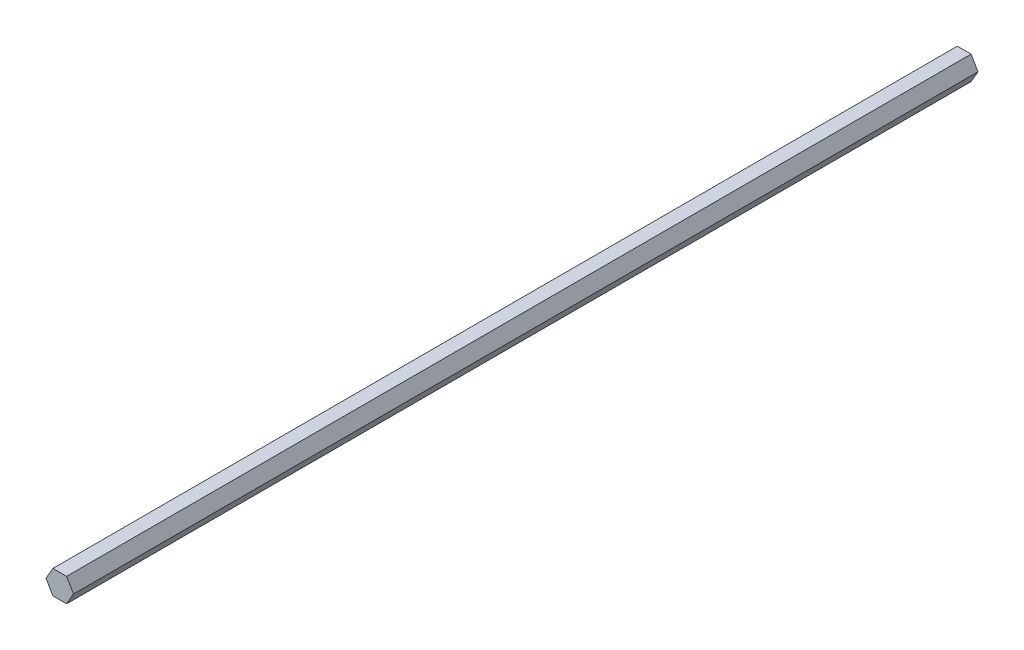
ISO-10303-21;
HEADER;
FILE_DESCRIPTION(('STEP AP214'),'2;1');
FILE_NAME('part.step','',(''),(''),'','','');
FILE_SCHEMA(('AUTOMOTIVE_DESIGN { 1 0 10303 214 1 1 1 1 }'));
ENDSEC;
DATA;
#1=APPLICATION_CONTEXT('core data for automotive mechanical design processes');
#2=APPLICATION_PROTOCOL_DEFINITION('international standard','automotive_design',2000,#1);
#3=PRODUCT_CONTEXT('',#1,'mechanical');
#4=PRODUCT('Part','Part','',(#3));
#5=PRODUCT_RELATED_PRODUCT_CATEGORY('part','',(#4));
#6=PRODUCT_DEFINITION_FORMATION('','',#4);
#7=PRODUCT_DEFINITION_CONTEXT('part definition',#1,'design');
#8=PRODUCT_DEFINITION('design','',#6,#7);
#9=PRODUCT_DEFINITION_SHAPE('','',#8);
#10=(LENGTH_UNIT() NAMED_UNIT(*) SI_UNIT(.MILLI.,.METRE.));
#11=(NAMED_UNIT(*) PLANE_ANGLE_UNIT() SI_UNIT($,.RADIAN.));
#12=(NAMED_UNIT(*) SI_UNIT($,.STERADIAN.) SOLID_ANGLE_UNIT());
#13=UNCERTAINTY_MEASURE_WITH_UNIT(LENGTH_MEASURE(1.E-05),#10,'distance_accuracy_value','');
#14=(GEOMETRIC_REPRESENTATION_CONTEXT(3) GLOBAL_UNCERTAINTY_ASSIGNED_CONTEXT((#13)) GLOBAL_UNIT_ASSIGNED_CONTEXT((#10,
#11,#12)) REPRESENTATION_CONTEXT('',''));
#15=CARTESIAN_POINT('',(0.,0.,0.));
#16=DIRECTION('',(0.,0.,1.));
#17=DIRECTION('',(1.,0.,0.));
#18=AXIS2_PLACEMENT_3D('',#15,#16,#17);
#19=CARTESIAN_POINT('',(-3.66617420935413,-6.35,241.3));
#20=DIRECTION('',(0.,1.,0.));
#21=DIRECTION('',(0.,0.,1.));
#22=AXIS2_PLACEMENT_3D('',#19,#20,#21);
#23=PLANE('',#22);
#24=DIRECTION('',(1.,0.,0.));
#25=VECTOR('',#24,1.);
#26=CARTESIAN_POINT('',(-3.66617420935413,-6.35,-241.3));
#27=LINE('',#26,#25);
#28=CARTESIAN_POINT('',(-3.66617420935413,-6.35,-241.3));
#29=VERTEX_POINT('',#28);
#30=CARTESIAN_POINT('',(3.66617420935412,-6.35,-241.3));
#31=VERTEX_POINT('',#30);
#32=EDGE_CURVE('E117',#29,#31,#27,.T.);
#33=ORIENTED_EDGE('',*,*,#32,.T.);
#34=DIRECTION('',(0.,0.,-1.));
#35=VECTOR('',#34,1.);
#36=CARTESIAN_POINT('',(3.66617420935412,-6.35,241.3));
#37=LINE('',#36,#35);
#38=CARTESIAN_POINT('',(3.66617420935412,-6.35,241.3));
#39=VERTEX_POINT('',#38);
#40=EDGE_CURVE('E11',#39,#31,#37,.T.);
#41=ORIENTED_EDGE('',*,*,#40,.F.);
#42=DIRECTION('',(1.,0.,0.));
#43=VECTOR('',#42,1.);
#44=CARTESIAN_POINT('',(-3.66617420935413,-6.35,241.3));
#45=LINE('',#44,#43);
#46=CARTESIAN_POINT('',(-3.66617420935413,-6.35,241.3));
#47=VERTEX_POINT('',#46);
#48=EDGE_CURVE('E127',#47,#39,#45,.T.);
#49=ORIENTED_EDGE('',*,*,#48,.F.);
#50=DIRECTION('',(0.,0.,-1.));
#51=VECTOR('',#50,1.);
#52=CARTESIAN_POINT('',(-3.66617420935413,-6.35,241.3));
#53=LINE('',#52,#51);
#54=EDGE_CURVE('E113',#47,#29,#53,.T.);
#55=ORIENTED_EDGE('',*,*,#54,.T.);
#56=EDGE_LOOP('',(#33,#41,#49,#55));
#57=FACE_BOUND('',#56,.T.);
#58=ADVANCED_FACE('F33',(#57),#23,.F.);
#59=CARTESIAN_POINT('',(3.66617420935412,-6.35,241.3));
#60=DIRECTION('',(-0.866025403784438,0.5,0.));
#61=DIRECTION('',(-0.5,-0.866025403784439,0.));
#62=AXIS2_PLACEMENT_3D('',#59,#60,#61);
#63=PLANE('',#62);
#64=DIRECTION('',(0.5,0.866025403784439,0.));
#65=VECTOR('',#64,1.);
#66=CARTESIAN_POINT('',(3.66617420935412,-6.35,-241.3));
#67=LINE('',#66,#65);
#68=CARTESIAN_POINT('',(7.33234841870825,0.,-241.3));
#69=VERTEX_POINT('',#68);
#70=EDGE_CURVE('E120',#31,#69,#67,.T.);
#71=ORIENTED_EDGE('',*,*,#70,.T.);
#72=DIRECTION('',(0.,0.,-1.));
#73=VECTOR('',#72,1.);
#74=CARTESIAN_POINT('',(7.33234841870825,0.,241.3));
#75=LINE('',#74,#73);
#76=CARTESIAN_POINT('',(7.33234841870825,0.,241.3));
#77=VERTEX_POINT('',#76);
#78=EDGE_CURVE('E41',#77,#69,#75,.T.);
#79=ORIENTED_EDGE('',*,*,#78,.F.);
#80=DIRECTION('',(0.5,0.866025403784439,0.));
#81=VECTOR('',#80,1.);
#82=CARTESIAN_POINT('',(3.66617420935412,-6.35,241.3));
#83=LINE('',#82,#81);
#84=EDGE_CURVE('E86',#39,#77,#83,.T.);
#85=ORIENTED_EDGE('',*,*,#84,.F.);
#86=ORIENTED_EDGE('',*,*,#40,.T.);
#87=EDGE_LOOP('',(#71,#79,#85,#86));
#88=FACE_BOUND('',#87,.T.);
#89=ADVANCED_FACE('F151',(#88),#63,.F.);
#90=CARTESIAN_POINT('',(7.33234841870825,0.,241.3));
#91=DIRECTION('',(-0.866025403784439,-0.5,0.));
#92=DIRECTION('',(0.5,-0.866025403784439,0.));
#93=AXIS2_PLACEMENT_3D('',#90,#91,#92);
#94=PLANE('',#93);
#95=DIRECTION('',(-0.5,0.866025403784439,0.));
#96=VECTOR('',#95,1.);
#97=CARTESIAN_POINT('',(7.33234841870825,0.,-241.3));
#98=LINE('',#97,#96);
#99=CARTESIAN_POINT('',(3.66617420935413,6.35,-241.3));
#100=VERTEX_POINT('',#99);
#101=EDGE_CURVE('E122',#69,#100,#98,.T.);
#102=ORIENTED_EDGE('',*,*,#101,.T.);
#103=DIRECTION('',(0.,0.,-1.));
#104=VECTOR('',#103,1.);
#105=CARTESIAN_POINT('',(3.66617420935413,6.35,241.3));
#106=LINE('',#105,#104);
#107=CARTESIAN_POINT('',(3.66617420935413,6.35,241.3));
#108=VERTEX_POINT('',#107);
#109=EDGE_CURVE('E108',#108,#100,#106,.T.);
#110=ORIENTED_EDGE('',*,*,#109,.F.);
#111=DIRECTION('',(-0.5,0.866025403784439,0.));
#112=VECTOR('',#111,1.);
#113=CARTESIAN_POINT('',(7.33234841870825,0.,241.3));
#114=LINE('',#113,#112);
#115=EDGE_CURVE('E99',#77,#108,#114,.T.);
#116=ORIENTED_EDGE('',*,*,#115,.F.);
#117=ORIENTED_EDGE('',*,*,#78,.T.);
#118=EDGE_LOOP('',(#102,#110,#116,#117));
#119=FACE_BOUND('',#118,.T.);
#120=ADVANCED_FACE('F133',(#119),#94,.F.);
#121=CARTESIAN_POINT('',(3.66617420935413,6.35,241.3));
#122=DIRECTION('',(0.,-1.,0.));
#123=DIRECTION('',(0.,0.,-1.));
#124=AXIS2_PLACEMENT_3D('',#121,#122,#123);
#125=PLANE('',#124);
#126=DIRECTION('',(-1.,0.,0.));
#127=VECTOR('',#126,1.);
#128=CARTESIAN_POINT('',(3.66617420935413,6.35,-241.3));
#129=LINE('',#128,#127);
#130=CARTESIAN_POINT('',(-3.66617420935412,6.35,-241.3));
#131=VERTEX_POINT('',#130);
#132=EDGE_CURVE('E107',#100,#131,#129,.T.);
#133=ORIENTED_EDGE('',*,*,#132,.T.);
#134=DIRECTION('',(0.,0.,-1.));
#135=VECTOR('',#134,1.);
#136=CARTESIAN_POINT('',(-3.66617420935412,6.35,241.3));
#137=LINE('',#136,#135);
#138=CARTESIAN_POINT('',(-3.66617420935412,6.35,241.3));
#139=VERTEX_POINT('',#138);
#140=EDGE_CURVE('E104',#139,#131,#137,.T.);
#141=ORIENTED_EDGE('',*,*,#140,.F.);
#142=DIRECTION('',(-1.,0.,0.));
#143=VECTOR('',#142,1.);
#144=CARTESIAN_POINT('',(3.66617420935413,6.35,241.3));
#145=LINE('',#144,#143);
#146=EDGE_CURVE('E93',#108,#139,#145,.T.);
#147=ORIENTED_EDGE('',*,*,#146,.F.);
#148=ORIENTED_EDGE('',*,*,#109,.T.);
#149=EDGE_LOOP('',(#133,#141,#147,#148));
#150=FACE_BOUND('',#149,.T.);
#151=ADVANCED_FACE('F105',(#150),#125,.F.);
#152=CARTESIAN_POINT('',(-3.66617420935412,6.35,241.3));
#153=DIRECTION('',(0.866025403784438,-0.5,0.));
#154=DIRECTION('',(0.5,0.866025403784439,0.));
#155=AXIS2_PLACEMENT_3D('',#152,#153,#154);
#156=PLANE('',#155);
#157=DIRECTION('',(-0.5,-0.866025403784438,0.));
#158=VECTOR('',#157,1.);
#159=CARTESIAN_POINT('',(-3.66617420935412,6.35,-241.3));
#160=LINE('',#159,#158);
#161=CARTESIAN_POINT('',(-7.33234841870825,0.,-241.3));
#162=VERTEX_POINT('',#161);
#163=EDGE_CURVE('E72',#131,#162,#160,.T.);
#164=ORIENTED_EDGE('',*,*,#163,.T.);
#165=DIRECTION('',(0.,0.,-1.));
#166=VECTOR('',#165,1.);
#167=CARTESIAN_POINT('',(-7.33234841870825,0.,241.3));
#168=LINE('',#167,#166);
#169=CARTESIAN_POINT('',(-7.33234841870825,0.,241.3));
#170=VERTEX_POINT('',#169);
#171=EDGE_CURVE('E109',#170,#162,#168,.T.);
#172=ORIENTED_EDGE('',*,*,#171,.F.);
#173=DIRECTION('',(-0.5,-0.866025403784438,0.));
#174=VECTOR('',#173,1.);
#175=CARTESIAN_POINT('',(-3.66617420935412,6.35,241.3));
#176=LINE('',#175,#174);
#177=EDGE_CURVE('E97',#139,#170,#176,.T.);
#178=ORIENTED_EDGE('',*,*,#177,.F.);
#179=ORIENTED_EDGE('',*,*,#140,.T.);
#180=EDGE_LOOP('',(#164,#172,#178,#179));
#181=FACE_BOUND('',#180,.T.);
#182=ADVANCED_FACE('F111',(#181),#156,.F.);
#183=CARTESIAN_POINT('',(-7.33234841870825,0.,241.3));
#184=DIRECTION('',(0.866025403784439,0.5,0.));
#185=DIRECTION('',(-0.5,0.866025403784439,0.));
#186=AXIS2_PLACEMENT_3D('',#183,#184,#185);
#187=PLANE('',#186);
#188=DIRECTION('',(0.5,-0.866025403784439,0.));
#189=VECTOR('',#188,1.);
#190=CARTESIAN_POINT('',(-7.33234841870825,0.,-241.3));
#191=LINE('',#190,#189);
#192=EDGE_CURVE('E78',#162,#29,#191,.T.);
#193=ORIENTED_EDGE('',*,*,#192,.T.);
#194=ORIENTED_EDGE('',*,*,#54,.F.);
#195=DIRECTION('',(0.5,-0.866025403784439,0.));
#196=VECTOR('',#195,1.);
#197=CARTESIAN_POINT('',(-7.33234841870825,0.,241.3));
#198=LINE('',#197,#196);
#199=EDGE_CURVE('E49',#170,#47,#198,.T.);
#200=ORIENTED_EDGE('',*,*,#199,.F.);
#201=ORIENTED_EDGE('',*,*,#171,.T.);
#202=EDGE_LOOP('',(#193,#194,#200,#201));
#203=FACE_BOUND('',#202,.T.);
#204=ADVANCED_FACE('F140',(#203),#187,.F.);
#205=CARTESIAN_POINT('',(0.,0.,241.3));
#206=DIRECTION('',(0.,0.,1.));
#207=DIRECTION('',(1.,0.,0.));
#208=AXIS2_PLACEMENT_3D('',#205,#206,#207);
#209=PLANE('',#208);
#210=ORIENTED_EDGE('',*,*,#48,.T.);
#211=ORIENTED_EDGE('',*,*,#84,.T.);
#212=ORIENTED_EDGE('',*,*,#115,.T.);
#213=ORIENTED_EDGE('',*,*,#146,.T.);
#214=ORIENTED_EDGE('',*,*,#177,.T.);
#215=ORIENTED_EDGE('',*,*,#199,.T.);
#216=EDGE_LOOP('',(#210,#211,#212,#213,#214,#215));
#217=FACE_BOUND('',#216,.T.);
#218=ADVANCED_FACE('F95',(#217),#209,.T.);
#219=CARTESIAN_POINT('',(0.,0.,-241.3));
#220=DIRECTION('',(0.,0.,1.));
#221=DIRECTION('',(1.,0.,0.));
#222=AXIS2_PLACEMENT_3D('',#219,#220,#221);
#223=PLANE('',#222);
#224=ORIENTED_EDGE('',*,*,#32,.F.);
#225=ORIENTED_EDGE('',*,*,#192,.F.);
#226=ORIENTED_EDGE('',*,*,#163,.F.);
#227=ORIENTED_EDGE('',*,*,#132,.F.);
#228=ORIENTED_EDGE('',*,*,#101,.F.);
#229=ORIENTED_EDGE('',*,*,#70,.F.);
#230=EDGE_LOOP('',(#224,#225,#226,#227,#228,#229));
#231=FACE_BOUND('',#230,.T.);
#232=ADVANCED_FACE('F136',(#231),#223,.F.);
#233=CLOSED_SHELL('',(#58,#89,#120,#151,#182,#204,#218,#232));
#234=MANIFOLD_SOLID_BREP('B2',#233);
#235=ADVANCED_BREP_SHAPE_REPRESENTATION('',(#18,#234),#14);
#236=SHAPE_DEFINITION_REPRESENTATION(#9,#235);
ENDSEC;
END-ISO-10303-21;
